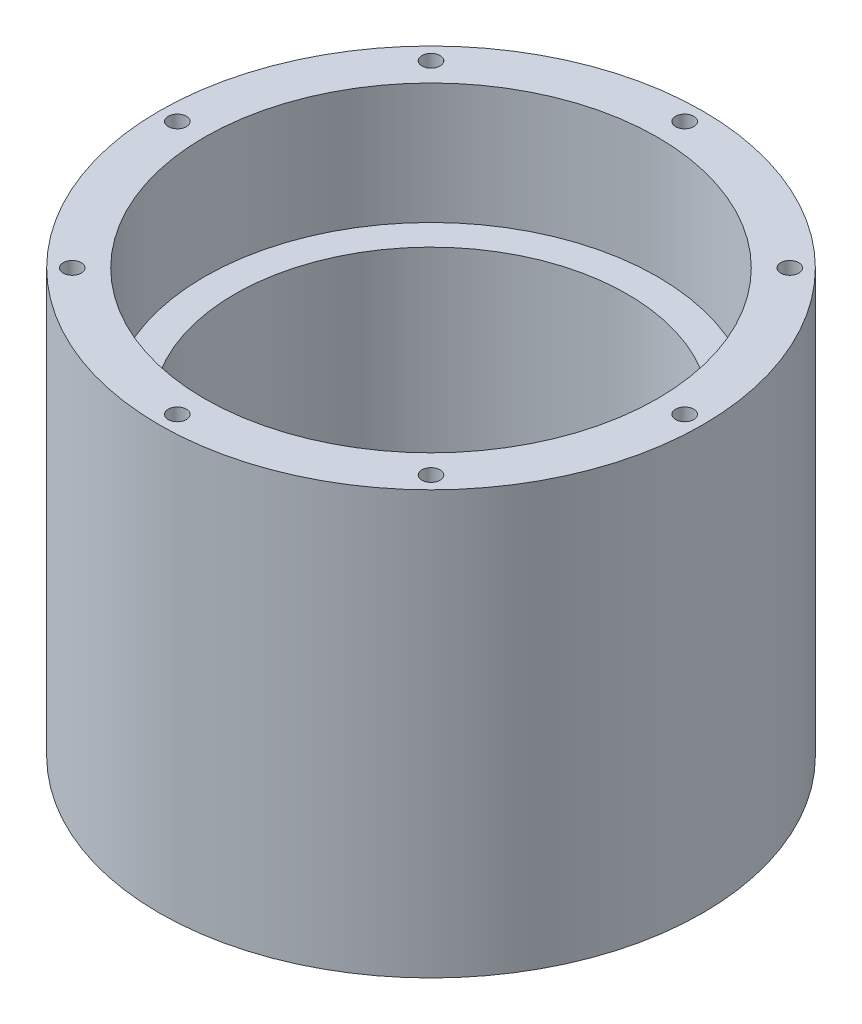
ISO-10303-21;
HEADER;
FILE_DESCRIPTION(('STEP AP214'),'2;1');
FILE_NAME('part.step','',(''),(''),'','','');
FILE_SCHEMA(('AUTOMOTIVE_DESIGN { 1 0 10303 214 1 1 1 1 }'));
ENDSEC;
DATA;
#1=APPLICATION_CONTEXT('core data for automotive mechanical design processes');
#2=APPLICATION_PROTOCOL_DEFINITION('international standard','automotive_design',2000,#1);
#3=PRODUCT_CONTEXT('',#1,'mechanical');
#4=PRODUCT('Part','Part','',(#3));
#5=PRODUCT_RELATED_PRODUCT_CATEGORY('part','',(#4));
#6=PRODUCT_DEFINITION_FORMATION('','',#4);
#7=PRODUCT_DEFINITION_CONTEXT('part definition',#1,'design');
#8=PRODUCT_DEFINITION('design','',#6,#7);
#9=PRODUCT_DEFINITION_SHAPE('','',#8);
#10=(LENGTH_UNIT() NAMED_UNIT(*) SI_UNIT(.MILLI.,.METRE.));
#11=(NAMED_UNIT(*) PLANE_ANGLE_UNIT() SI_UNIT($,.RADIAN.));
#12=(NAMED_UNIT(*) SI_UNIT($,.STERADIAN.) SOLID_ANGLE_UNIT());
#13=UNCERTAINTY_MEASURE_WITH_UNIT(LENGTH_MEASURE(1.E-05),#10,'distance_accuracy_value','');
#14=(GEOMETRIC_REPRESENTATION_CONTEXT(3) GLOBAL_UNCERTAINTY_ASSIGNED_CONTEXT((#13)) GLOBAL_UNIT_ASSIGNED_CONTEXT((#10,
#11,#12)) REPRESENTATION_CONTEXT('',''));
#15=CARTESIAN_POINT('',(0.,0.,0.));
#16=DIRECTION('',(0.,0.,1.));
#17=DIRECTION('',(1.,0.,0.));
#18=AXIS2_PLACEMENT_3D('',#15,#16,#17);
#19=CARTESIAN_POINT('',(0.,35.,0.));
#20=DIRECTION('',(0.,-1.,0.));
#21=DIRECTION('',(0.,0.,-1.));
#22=AXIS2_PLACEMENT_3D('',#19,#20,#21);
#23=CYLINDRICAL_SURFACE('',#22,37.5);
#24=CARTESIAN_POINT('',(0.,-35.,0.));
#25=DIRECTION('',(0.,1.,0.));
#26=DIRECTION('',(0.,0.,1.));
#27=AXIS2_PLACEMENT_3D('',#24,#25,#26);
#28=CIRCLE('',#27,37.5);
#29=CARTESIAN_POINT('',(0.,-35.,37.5));
#30=VERTEX_POINT('',#29);
#31=EDGE_CURVE('E62',#30,#30,#28,.T.);
#32=ORIENTED_EDGE('',*,*,#31,.F.);
#33=EDGE_LOOP('',(#32));
#34=FACE_BOUND('',#33,.T.);
#35=CARTESIAN_POINT('',(0.,-15.,0.));
#36=DIRECTION('',(0.,1.,0.));
#37=DIRECTION('',(0.,0.,1.));
#38=AXIS2_PLACEMENT_3D('',#35,#36,#37);
#39=CIRCLE('',#38,37.5);
#40=CARTESIAN_POINT('',(0.,-15.,37.5));
#41=VERTEX_POINT('',#40);
#42=EDGE_CURVE('E64',#41,#41,#39,.T.);
#43=ORIENTED_EDGE('',*,*,#42,.T.);
#44=EDGE_LOOP('',(#43));
#45=FACE_BOUND('',#44,.T.);
#46=ADVANCED_FACE('F43',(#34,#45),#23,.F.);
#47=CARTESIAN_POINT('',(0.,35.,0.));
#48=DIRECTION('',(0.,1.,0.));
#49=DIRECTION('',(0.,0.,1.));
#50=AXIS2_PLACEMENT_3D('',#47,#48,#49);
#51=PLANE('',#50);
#52=CARTESIAN_POINT('',(-42.,35.,1.46642216231412E-13));
#53=DIRECTION('',(0.,1.,0.));
#54=DIRECTION('',(1.,0.,0.));
#55=AXIS2_PLACEMENT_3D('',#52,#53,#54);
#56=CIRCLE('',#55,1.5);
#57=CARTESIAN_POINT('',(-40.5,35.,1.41404994223147E-13));
#58=VERTEX_POINT('',#57);
#59=EDGE_CURVE('E169',#58,#58,#56,.T.);
#60=ORIENTED_EDGE('',*,*,#59,.F.);
#61=EDGE_LOOP('',(#60));
#62=FACE_BOUND('',#61,.T.);
#63=CARTESIAN_POINT('',(-29.6984848098348,35.,29.6984848098352));
#64=DIRECTION('',(0.,1.,0.));
#65=DIRECTION('',(0.707106781186544,0.,-0.707106781186551));
#66=AXIS2_PLACEMENT_3D('',#63,#64,#65);
#67=CIRCLE('',#66,1.5);
#68=CARTESIAN_POINT('',(-28.637824638055,35.,28.6378246380553));
#69=VERTEX_POINT('',#68);
#70=EDGE_CURVE('E175',#69,#69,#67,.T.);
#71=ORIENTED_EDGE('',*,*,#70,.F.);
#72=EDGE_LOOP('',(#71));
#73=FACE_BOUND('',#72,.T.);
#74=CARTESIAN_POINT('',(0.,35.,42.));
#75=DIRECTION('',(0.,1.,0.));
#76=DIRECTION('',(0.,0.,-1.));
#77=AXIS2_PLACEMENT_3D('',#74,#75,#76);
#78=CIRCLE('',#77,1.5);
#79=CARTESIAN_POINT('',(0.,35.,40.5));
#80=VERTEX_POINT('',#79);
#81=EDGE_CURVE('E181',#80,#80,#78,.T.);
#82=ORIENTED_EDGE('',*,*,#81,.F.);
#83=EDGE_LOOP('',(#82));
#84=FACE_BOUND('',#83,.T.);
#85=CARTESIAN_POINT('',(29.6984848098353,35.,29.6984848098347));
#86=DIRECTION('',(0.,1.,0.));
#87=DIRECTION('',(-0.707106781186554,0.,-0.707106781186541));
#88=AXIS2_PLACEMENT_3D('',#85,#86,#87);
#89=CIRCLE('',#88,1.5);
#90=CARTESIAN_POINT('',(28.6378246380554,35.,28.6378246380549));
#91=VERTEX_POINT('',#90);
#92=EDGE_CURVE('E157',#91,#91,#89,.T.);
#93=ORIENTED_EDGE('',*,*,#92,.F.);
#94=EDGE_LOOP('',(#93));
#95=FACE_BOUND('',#94,.T.);
#96=CARTESIAN_POINT('',(42.,35.,-4.39926648694235E-13));
#97=DIRECTION('',(0.,1.,0.));
#98=DIRECTION('',(-1.,0.,0.));
#99=AXIS2_PLACEMENT_3D('',#96,#97,#98);
#100=CIRCLE('',#99,1.5);
#101=CARTESIAN_POINT('',(40.5,35.,-4.24214982669441E-13));
#102=VERTEX_POINT('',#101);
#103=EDGE_CURVE('E153',#102,#102,#100,.T.);
#104=ORIENTED_EDGE('',*,*,#103,.F.);
#105=EDGE_LOOP('',(#104));
#106=FACE_BOUND('',#105,.T.);
#107=CARTESIAN_POINT('',(29.6984848098346,35.,-29.6984848098354));
#108=DIRECTION('',(0.,1.,0.));
#109=DIRECTION('',(-0.707106781186539,0.,0.707106781186556));
#110=AXIS2_PLACEMENT_3D('',#107,#108,#109);
#111=CIRCLE('',#110,1.5);
#112=CARTESIAN_POINT('',(28.6378246380548,35.,-28.6378246380555));
#113=VERTEX_POINT('',#112);
#114=EDGE_CURVE('E160',#113,#113,#111,.T.);
#115=ORIENTED_EDGE('',*,*,#114,.F.);
#116=EDGE_LOOP('',(#115));
#117=FACE_BOUND('',#116,.T.);
#118=CARTESIAN_POINT('',(-29.6984848098351,35.,-29.6984848098349));
#119=DIRECTION('',(0.,1.,0.));
#120=DIRECTION('',(0.707106781186549,0.,0.707106781186546));
#121=AXIS2_PLACEMENT_3D('',#118,#119,#120);
#122=CIRCLE('',#121,1.5);
#123=CARTESIAN_POINT('',(-28.6378246380552,35.,-28.6378246380551));
#124=VERTEX_POINT('',#123);
#125=EDGE_CURVE('E168',#124,#124,#122,.T.);
#126=ORIENTED_EDGE('',*,*,#125,.F.);
#127=EDGE_LOOP('',(#126));
#128=FACE_BOUND('',#127,.T.);
#129=CARTESIAN_POINT('',(0.,35.,-42.));
#130=DIRECTION('',(0.,1.,0.));
#131=DIRECTION('',(0.,0.,1.));
#132=AXIS2_PLACEMENT_3D('',#129,#130,#131);
#133=CIRCLE('',#132,1.5);
#134=CARTESIAN_POINT('',(0.,35.,-40.5));
#135=VERTEX_POINT('',#134);
#136=EDGE_CURVE('E79',#135,#135,#133,.T.);
#137=ORIENTED_EDGE('',*,*,#136,.F.);
#138=EDGE_LOOP('',(#137));
#139=FACE_BOUND('',#138,.T.);
#140=CARTESIAN_POINT('',(0.,35.,0.));
#141=DIRECTION('',(0.,1.,0.));
#142=DIRECTION('',(0.,0.,1.));
#143=AXIS2_PLACEMENT_3D('',#140,#141,#142);
#144=CIRCLE('',#143,45.);
#145=CARTESIAN_POINT('',(0.,35.,45.));
#146=VERTEX_POINT('',#145);
#147=EDGE_CURVE('E50',#146,#146,#144,.T.);
#148=ORIENTED_EDGE('',*,*,#147,.T.);
#149=EDGE_LOOP('',(#148));
#150=FACE_BOUND('',#149,.T.);
#151=CARTESIAN_POINT('',(0.,35.,0.));
#152=DIRECTION('',(0.,1.,0.));
#153=DIRECTION('',(0.,0.,1.));
#154=AXIS2_PLACEMENT_3D('',#151,#152,#153);
#155=CIRCLE('',#154,37.5);
#156=CARTESIAN_POINT('',(0.,35.,37.5));
#157=VERTEX_POINT('',#156);
#158=EDGE_CURVE('E59',#157,#157,#155,.T.);
#159=ORIENTED_EDGE('',*,*,#158,.F.);
#160=EDGE_LOOP('',(#159));
#161=FACE_BOUND('',#160,.T.);
#162=ADVANCED_FACE('F86',(#62,#73,#84,#95,#106,#117,#128,#139,#150,#161),#51,.T.);
#163=CARTESIAN_POINT('',(0.,-35.,0.));
#164=DIRECTION('',(0.,1.,0.));
#165=DIRECTION('',(0.,0.,1.));
#166=AXIS2_PLACEMENT_3D('',#163,#164,#165);
#167=PLANE('',#166);
#168=CARTESIAN_POINT('',(-42.,-35.,1.46642216231412E-13));
#169=DIRECTION('',(0.,1.,0.));
#170=DIRECTION('',(1.,0.,0.));
#171=AXIS2_PLACEMENT_3D('',#168,#169,#170);
#172=CIRCLE('',#171,1.5);
#173=CARTESIAN_POINT('',(-40.5,-35.,1.41404994223147E-13));
#174=VERTEX_POINT('',#173);
#175=EDGE_CURVE('E165',#174,#174,#172,.T.);
#176=ORIENTED_EDGE('',*,*,#175,.T.);
#177=EDGE_LOOP('',(#176));
#178=FACE_BOUND('',#177,.T.);
#179=CARTESIAN_POINT('',(-29.6984848098348,-35.,29.6984848098352));
#180=DIRECTION('',(0.,1.,0.));
#181=DIRECTION('',(0.707106781186544,0.,-0.707106781186551));
#182=AXIS2_PLACEMENT_3D('',#179,#180,#181);
#183=CIRCLE('',#182,1.5);
#184=CARTESIAN_POINT('',(-28.637824638055,-35.,28.6378246380553));
#185=VERTEX_POINT('',#184);
#186=EDGE_CURVE('E172',#185,#185,#183,.T.);
#187=ORIENTED_EDGE('',*,*,#186,.T.);
#188=EDGE_LOOP('',(#187));
#189=FACE_BOUND('',#188,.T.);
#190=CARTESIAN_POINT('',(0.,-35.,42.));
#191=DIRECTION('',(0.,1.,0.));
#192=DIRECTION('',(0.,0.,-1.));
#193=AXIS2_PLACEMENT_3D('',#190,#191,#192);
#194=CIRCLE('',#193,1.5);
#195=CARTESIAN_POINT('',(0.,-35.,40.5));
#196=VERTEX_POINT('',#195);
#197=EDGE_CURVE('E178',#196,#196,#194,.T.);
#198=ORIENTED_EDGE('',*,*,#197,.T.);
#199=EDGE_LOOP('',(#198));
#200=FACE_BOUND('',#199,.T.);
#201=CARTESIAN_POINT('',(29.6984848098353,-35.,29.6984848098347));
#202=DIRECTION('',(0.,1.,0.));
#203=DIRECTION('',(-0.707106781186554,0.,-0.707106781186541));
#204=AXIS2_PLACEMENT_3D('',#201,#202,#203);
#205=CIRCLE('',#204,1.5);
#206=CARTESIAN_POINT('',(28.6378246380554,-35.,28.6378246380549));
#207=VERTEX_POINT('',#206);
#208=EDGE_CURVE('E184',#207,#207,#205,.T.);
#209=ORIENTED_EDGE('',*,*,#208,.T.);
#210=EDGE_LOOP('',(#209));
#211=FACE_BOUND('',#210,.T.);
#212=CARTESIAN_POINT('',(42.,-35.,-4.39926648694235E-13));
#213=DIRECTION('',(0.,1.,0.));
#214=DIRECTION('',(-1.,0.,0.));
#215=AXIS2_PLACEMENT_3D('',#212,#213,#214);
#216=CIRCLE('',#215,1.5);
#217=CARTESIAN_POINT('',(40.5,-35.,-4.24214982669441E-13));
#218=VERTEX_POINT('',#217);
#219=EDGE_CURVE('E150',#218,#218,#216,.T.);
#220=ORIENTED_EDGE('',*,*,#219,.T.);
#221=EDGE_LOOP('',(#220));
#222=FACE_BOUND('',#221,.T.);
#223=CARTESIAN_POINT('',(29.6984848098346,-35.,-29.6984848098354));
#224=DIRECTION('',(0.,1.,0.));
#225=DIRECTION('',(-0.707106781186539,0.,0.707106781186556));
#226=AXIS2_PLACEMENT_3D('',#223,#224,#225);
#227=CIRCLE('',#226,1.5);
#228=CARTESIAN_POINT('',(28.6378246380548,-35.,-28.6378246380555));
#229=VERTEX_POINT('',#228);
#230=EDGE_CURVE('E155',#229,#229,#227,.T.);
#231=ORIENTED_EDGE('',*,*,#230,.T.);
#232=EDGE_LOOP('',(#231));
#233=FACE_BOUND('',#232,.T.);
#234=CARTESIAN_POINT('',(-29.6984848098351,-35.,-29.6984848098349));
#235=DIRECTION('',(0.,1.,0.));
#236=DIRECTION('',(0.707106781186549,0.,0.707106781186546));
#237=AXIS2_PLACEMENT_3D('',#234,#235,#236);
#238=CIRCLE('',#237,1.5);
#239=CARTESIAN_POINT('',(-28.6378246380552,-35.,-28.6378246380551));
#240=VERTEX_POINT('',#239);
#241=EDGE_CURVE('E189',#240,#240,#238,.T.);
#242=ORIENTED_EDGE('',*,*,#241,.T.);
#243=EDGE_LOOP('',(#242));
#244=FACE_BOUND('',#243,.T.);
#245=CARTESIAN_POINT('',(0.,-35.,-42.));
#246=DIRECTION('',(0.,1.,0.));
#247=DIRECTION('',(0.,0.,1.));
#248=AXIS2_PLACEMENT_3D('',#245,#246,#247);
#249=CIRCLE('',#248,1.5);
#250=CARTESIAN_POINT('',(0.,-35.,-40.5));
#251=VERTEX_POINT('',#250);
#252=EDGE_CURVE('E76',#251,#251,#249,.T.);
#253=ORIENTED_EDGE('',*,*,#252,.T.);
#254=EDGE_LOOP('',(#253));
#255=FACE_BOUND('',#254,.T.);
#256=CARTESIAN_POINT('',(0.,-35.,0.));
#257=DIRECTION('',(0.,1.,0.));
#258=DIRECTION('',(0.,0.,1.));
#259=AXIS2_PLACEMENT_3D('',#256,#257,#258);
#260=CIRCLE('',#259,45.);
#261=CARTESIAN_POINT('',(0.,-35.,45.));
#262=VERTEX_POINT('',#261);
#263=EDGE_CURVE('E54',#262,#262,#260,.T.);
#264=ORIENTED_EDGE('',*,*,#263,.F.);
#265=EDGE_LOOP('',(#264));
#266=FACE_BOUND('',#265,.T.);
#267=ORIENTED_EDGE('',*,*,#31,.T.);
#268=EDGE_LOOP('',(#267));
#269=FACE_BOUND('',#268,.T.);
#270=ADVANCED_FACE('F88',(#178,#189,#200,#211,#222,#233,#244,#255,#266,#269),#167,.F.);
#271=CARTESIAN_POINT('',(0.,35.,0.));
#272=DIRECTION('',(0.,-1.,0.));
#273=DIRECTION('',(0.,0.,-1.));
#274=AXIS2_PLACEMENT_3D('',#271,#272,#273);
#275=CYLINDRICAL_SURFACE('',#274,45.);
#276=ORIENTED_EDGE('',*,*,#147,.F.);
#277=EDGE_LOOP('',(#276));
#278=FACE_BOUND('',#277,.T.);
#279=ORIENTED_EDGE('',*,*,#263,.T.);
#280=EDGE_LOOP('',(#279));
#281=FACE_BOUND('',#280,.T.);
#282=ADVANCED_FACE('F45',(#278,#281),#275,.T.);
#283=CARTESIAN_POINT('',(0.,15.,0.));
#284=DIRECTION('',(0.,1.,0.));
#285=DIRECTION('',(0.,0.,1.));
#286=AXIS2_PLACEMENT_3D('',#283,#284,#285);
#287=CIRCLE('',#286,37.5);
#288=CARTESIAN_POINT('',(0.,15.,37.5));
#289=VERTEX_POINT('',#288);
#290=EDGE_CURVE('E11',#289,#289,#287,.T.);
#291=ORIENTED_EDGE('',*,*,#290,.F.);
#292=EDGE_LOOP('',(#291));
#293=FACE_BOUND('',#292,.T.);
#294=ORIENTED_EDGE('',*,*,#158,.T.);
#295=EDGE_LOOP('',(#294));
#296=FACE_BOUND('',#295,.T.);
#297=ADVANCED_FACE('F84',(#293,#296),#23,.F.);
#298=CARTESIAN_POINT('',(0.,15.,0.));
#299=DIRECTION('',(0.,1.,0.));
#300=DIRECTION('',(0.,0.,1.));
#301=AXIS2_PLACEMENT_3D('',#298,#299,#300);
#302=PLANE('',#301);
#303=CARTESIAN_POINT('',(0.,15.,0.));
#304=DIRECTION('',(0.,1.,0.));
#305=DIRECTION('',(0.,0.,1.));
#306=AXIS2_PLACEMENT_3D('',#303,#304,#305);
#307=CIRCLE('',#306,32.5);
#308=CARTESIAN_POINT('',(0.,15.,32.5));
#309=VERTEX_POINT('',#308);
#310=EDGE_CURVE('E66',#309,#309,#307,.T.);
#311=ORIENTED_EDGE('',*,*,#310,.F.);
#312=EDGE_LOOP('',(#311));
#313=FACE_BOUND('',#312,.T.);
#314=ORIENTED_EDGE('',*,*,#290,.T.);
#315=EDGE_LOOP('',(#314));
#316=FACE_BOUND('',#315,.T.);
#317=ADVANCED_FACE('F103',(#313,#316),#302,.T.);
#318=CARTESIAN_POINT('',(0.,-15.,0.));
#319=DIRECTION('',(0.,1.,0.));
#320=DIRECTION('',(0.,0.,1.));
#321=AXIS2_PLACEMENT_3D('',#318,#319,#320);
#322=PLANE('',#321);
#323=CARTESIAN_POINT('',(0.,-15.,0.));
#324=DIRECTION('',(0.,1.,0.));
#325=DIRECTION('',(0.,0.,1.));
#326=AXIS2_PLACEMENT_3D('',#323,#324,#325);
#327=CIRCLE('',#326,32.5);
#328=CARTESIAN_POINT('',(0.,-15.,32.5));
#329=VERTEX_POINT('',#328);
#330=EDGE_CURVE('E71',#329,#329,#327,.T.);
#331=ORIENTED_EDGE('',*,*,#330,.T.);
#332=EDGE_LOOP('',(#331));
#333=FACE_BOUND('',#332,.T.);
#334=ORIENTED_EDGE('',*,*,#42,.F.);
#335=EDGE_LOOP('',(#334));
#336=FACE_BOUND('',#335,.T.);
#337=ADVANCED_FACE('F105',(#333,#336),#322,.F.);
#338=CARTESIAN_POINT('',(0.,15.,0.));
#339=DIRECTION('',(0.,-1.,0.));
#340=DIRECTION('',(0.,0.,-1.));
#341=AXIS2_PLACEMENT_3D('',#338,#339,#340);
#342=CYLINDRICAL_SURFACE('',#341,32.5);
#343=ORIENTED_EDGE('',*,*,#310,.T.);
#344=EDGE_LOOP('',(#343));
#345=FACE_BOUND('',#344,.T.);
#346=ORIENTED_EDGE('',*,*,#330,.F.);
#347=EDGE_LOOP('',(#346));
#348=FACE_BOUND('',#347,.T.);
#349=ADVANCED_FACE('F108',(#345,#348),#342,.F.);
#350=CARTESIAN_POINT('',(0.,-35.,-42.));
#351=DIRECTION('',(0.,1.,0.));
#352=DIRECTION('',(0.,0.,1.));
#353=AXIS2_PLACEMENT_3D('',#350,#351,#352);
#354=CYLINDRICAL_SURFACE('',#353,1.5);
#355=ORIENTED_EDGE('',*,*,#252,.F.);
#356=EDGE_LOOP('',(#355));
#357=FACE_BOUND('',#356,.T.);
#358=ORIENTED_EDGE('',*,*,#136,.T.);
#359=EDGE_LOOP('',(#358));
#360=FACE_BOUND('',#359,.T.);
#361=ADVANCED_FACE('F115',(#357,#360),#354,.F.);
#362=CARTESIAN_POINT('',(-29.6984848098351,-35.,-29.6984848098349));
#363=DIRECTION('',(0.,1.,0.));
#364=DIRECTION('',(0.,0.,1.));
#365=AXIS2_PLACEMENT_3D('',#362,#363,#364);
#366=CYLINDRICAL_SURFACE('',#365,1.5);
#367=ORIENTED_EDGE('',*,*,#241,.F.);
#368=EDGE_LOOP('',(#367));
#369=FACE_BOUND('',#368,.T.);
#370=ORIENTED_EDGE('',*,*,#125,.T.);
#371=EDGE_LOOP('',(#370));
#372=FACE_BOUND('',#371,.T.);
#373=ADVANCED_FACE('F117',(#369,#372),#366,.F.);
#374=CARTESIAN_POINT('',(29.6984848098346,-35.,-29.6984848098354));
#375=DIRECTION('',(0.,1.,0.));
#376=DIRECTION('',(0.,0.,1.));
#377=AXIS2_PLACEMENT_3D('',#374,#375,#376);
#378=CYLINDRICAL_SURFACE('',#377,1.5);
#379=ORIENTED_EDGE('',*,*,#230,.F.);
#380=EDGE_LOOP('',(#379));
#381=FACE_BOUND('',#380,.T.);
#382=ORIENTED_EDGE('',*,*,#114,.T.);
#383=EDGE_LOOP('',(#382));
#384=FACE_BOUND('',#383,.T.);
#385=ADVANCED_FACE('F121',(#381,#384),#378,.F.);
#386=CARTESIAN_POINT('',(42.,-35.,-4.39926648694235E-13));
#387=DIRECTION('',(0.,1.,0.));
#388=DIRECTION('',(0.,0.,1.));
#389=AXIS2_PLACEMENT_3D('',#386,#387,#388);
#390=CYLINDRICAL_SURFACE('',#389,1.5);
#391=ORIENTED_EDGE('',*,*,#219,.F.);
#392=EDGE_LOOP('',(#391));
#393=FACE_BOUND('',#392,.T.);
#394=ORIENTED_EDGE('',*,*,#103,.T.);
#395=EDGE_LOOP('',(#394));
#396=FACE_BOUND('',#395,.T.);
#397=ADVANCED_FACE('F127',(#393,#396),#390,.F.);
#398=CARTESIAN_POINT('',(29.6984848098353,-35.,29.6984848098347));
#399=DIRECTION('',(0.,1.,0.));
#400=DIRECTION('',(0.,0.,1.));
#401=AXIS2_PLACEMENT_3D('',#398,#399,#400);
#402=CYLINDRICAL_SURFACE('',#401,1.5);
#403=ORIENTED_EDGE('',*,*,#208,.F.);
#404=EDGE_LOOP('',(#403));
#405=FACE_BOUND('',#404,.T.);
#406=ORIENTED_EDGE('',*,*,#92,.T.);
#407=EDGE_LOOP('',(#406));
#408=FACE_BOUND('',#407,.T.);
#409=ADVANCED_FACE('F123',(#405,#408),#402,.F.);
#410=CARTESIAN_POINT('',(0.,-35.,42.));
#411=DIRECTION('',(0.,1.,0.));
#412=DIRECTION('',(0.,0.,1.));
#413=AXIS2_PLACEMENT_3D('',#410,#411,#412);
#414=CYLINDRICAL_SURFACE('',#413,1.5);
#415=ORIENTED_EDGE('',*,*,#197,.F.);
#416=EDGE_LOOP('',(#415));
#417=FACE_BOUND('',#416,.T.);
#418=ORIENTED_EDGE('',*,*,#81,.T.);
#419=EDGE_LOOP('',(#418));
#420=FACE_BOUND('',#419,.T.);
#421=ADVANCED_FACE('F126',(#417,#420),#414,.F.);
#422=CARTESIAN_POINT('',(-29.6984848098348,-35.,29.6984848098352));
#423=DIRECTION('',(0.,1.,0.));
#424=DIRECTION('',(0.,0.,1.));
#425=AXIS2_PLACEMENT_3D('',#422,#423,#424);
#426=CYLINDRICAL_SURFACE('',#425,1.5);
#427=ORIENTED_EDGE('',*,*,#186,.F.);
#428=EDGE_LOOP('',(#427));
#429=FACE_BOUND('',#428,.T.);
#430=ORIENTED_EDGE('',*,*,#70,.T.);
#431=EDGE_LOOP('',(#430));
#432=FACE_BOUND('',#431,.T.);
#433=ADVANCED_FACE('F131',(#429,#432),#426,.F.);
#434=CARTESIAN_POINT('',(-42.,-35.,1.46642216231412E-13));
#435=DIRECTION('',(0.,1.,0.));
#436=DIRECTION('',(0.,0.,1.));
#437=AXIS2_PLACEMENT_3D('',#434,#435,#436);
#438=CYLINDRICAL_SURFACE('',#437,1.5);
#439=ORIENTED_EDGE('',*,*,#175,.F.);
#440=EDGE_LOOP('',(#439));
#441=FACE_BOUND('',#440,.T.);
#442=ORIENTED_EDGE('',*,*,#59,.T.);
#443=EDGE_LOOP('',(#442));
#444=FACE_BOUND('',#443,.T.);
#445=ADVANCED_FACE('F135',(#441,#444),#438,.F.);
#446=CLOSED_SHELL('',(#46,#162,#270,#282,#297,#317,#337,#349,#361,#373,#385,#397,#409,#421,#433,#445));
#447=MANIFOLD_SOLID_BREP('B2',#446);
#448=ADVANCED_BREP_SHAPE_REPRESENTATION('',(#18,#447),#14);
#449=SHAPE_DEFINITION_REPRESENTATION(#9,#448);
ENDSEC;
END-ISO-10303-21;
